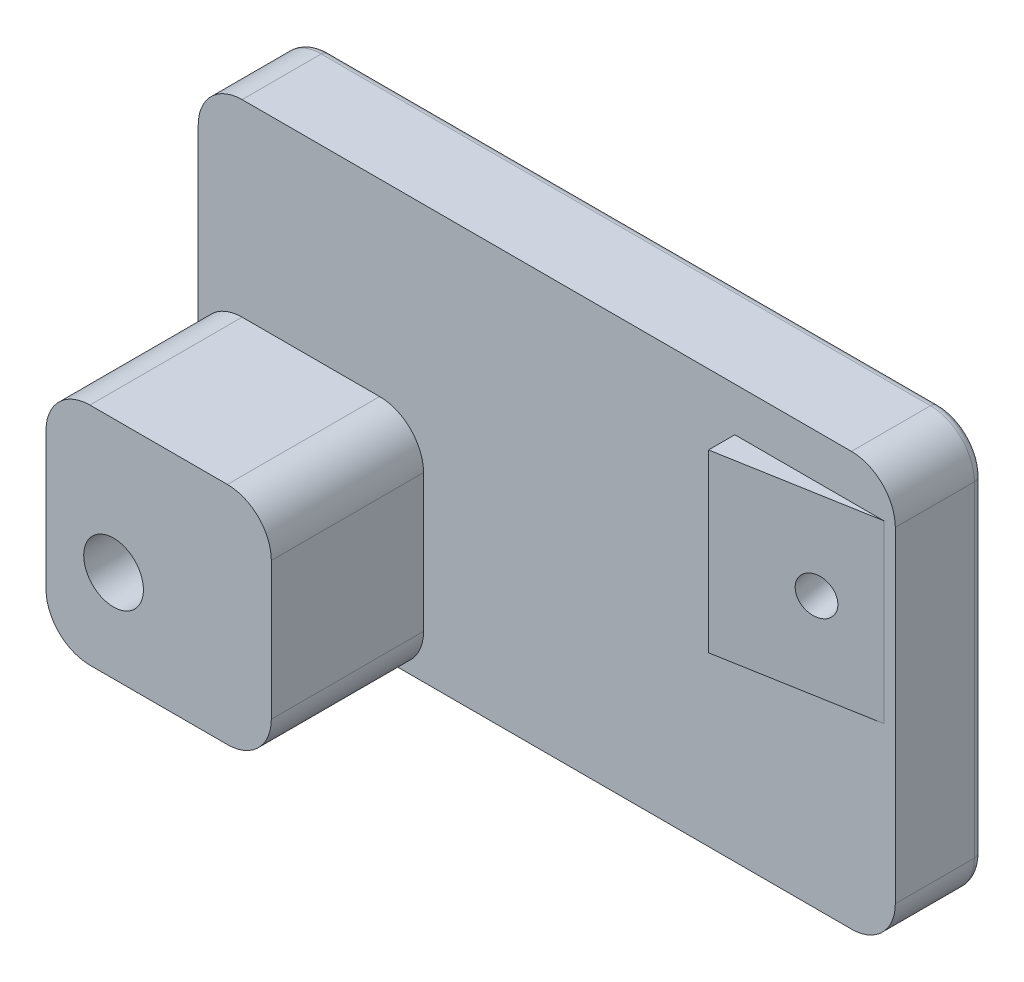
ISO-10303-21;
HEADER;
FILE_DESCRIPTION(('STEP AP214'),'2;1');
FILE_NAME('part.step','',(''),(''),'','','');
FILE_SCHEMA(('AUTOMOTIVE_DESIGN { 1 0 10303 214 1 1 1 1 }'));
ENDSEC;
DATA;
#1=APPLICATION_CONTEXT('core data for automotive mechanical design processes');
#2=APPLICATION_PROTOCOL_DEFINITION('international standard','automotive_design',2000,#1);
#3=PRODUCT_CONTEXT('',#1,'mechanical');
#4=PRODUCT('Part','Part','',(#3));
#5=PRODUCT_RELATED_PRODUCT_CATEGORY('part','',(#4));
#6=PRODUCT_DEFINITION_FORMATION('','',#4);
#7=PRODUCT_DEFINITION_CONTEXT('part definition',#1,'design');
#8=PRODUCT_DEFINITION('design','',#6,#7);
#9=PRODUCT_DEFINITION_SHAPE('','',#8);
#10=(LENGTH_UNIT() NAMED_UNIT(*) SI_UNIT(.MILLI.,.METRE.));
#11=(NAMED_UNIT(*) PLANE_ANGLE_UNIT() SI_UNIT($,.RADIAN.));
#12=(NAMED_UNIT(*) SI_UNIT($,.STERADIAN.) SOLID_ANGLE_UNIT());
#13=UNCERTAINTY_MEASURE_WITH_UNIT(LENGTH_MEASURE(1.E-05),#10,'distance_accuracy_value','');
#14=(GEOMETRIC_REPRESENTATION_CONTEXT(3) GLOBAL_UNCERTAINTY_ASSIGNED_CONTEXT((#13)) GLOBAL_UNIT_ASSIGNED_CONTEXT((#10,
#11,#12)) REPRESENTATION_CONTEXT('',''));
#15=CARTESIAN_POINT('',(0.,0.,0.));
#16=DIRECTION('',(0.,0.,1.));
#17=DIRECTION('',(1.,0.,0.));
#18=AXIS2_PLACEMENT_3D('',#15,#16,#17);
#19=CARTESIAN_POINT('',(-15.6825473539519,-7.92032989690722,10.));
#20=DIRECTION('',(-1.,0.,0.));
#21=DIRECTION('',(0.,-1.,0.));
#22=AXIS2_PLACEMENT_3D('',#19,#20,#21);
#23=PLANE('',#22);
#24=DIRECTION('',(0.,1.,0.));
#25=VECTOR('',#24,1.);
#26=CARTESIAN_POINT('',(-15.6825473539519,-7.92032989690722,10.));
#27=LINE('',#26,#25);
#28=CARTESIAN_POINT('',(-15.6825473539519,-25.0233148041237,10.));
#29=VERTEX_POINT('',#28);
#30=CARTESIAN_POINT('',(-15.6825473539519,-25.0230836681071,10.));
#31=VERTEX_POINT('',#30);
#32=EDGE_CURVE('E268',#29,#31,#27,.T.);
#33=ORIENTED_EDGE('',*,*,#32,.T.);
#34=DIRECTION('',(0.,0.,1.));
#35=VECTOR('',#34,1.);
#36=CARTESIAN_POINT('',(-15.6825473539519,-25.0230836681071,7.3288));
#37=LINE('',#36,#35);
#38=CARTESIAN_POINT('',(-15.6825473539519,-25.0230836681071,27.3288));
#39=VERTEX_POINT('',#38);
#40=EDGE_CURVE('E258',#31,#39,#37,.T.);
#41=ORIENTED_EDGE('',*,*,#40,.T.);
#42=DIRECTION('',(0.,1.,0.));
#43=VECTOR('',#42,1.);
#44=CARTESIAN_POINT('',(-15.6825473539519,-25.0233148041237,27.3288));
#45=LINE('',#44,#43);
#46=CARTESIAN_POINT('',(-15.6825473539519,-25.0233148041237,27.3288));
#47=VERTEX_POINT('',#46);
#48=EDGE_CURVE('E221',#47,#39,#45,.T.);
#49=ORIENTED_EDGE('',*,*,#48,.F.);
#50=DIRECTION('',(0.,0.,-1.));
#51=VECTOR('',#50,1.);
#52=CARTESIAN_POINT('',(-15.6825473539519,-25.0233148041237,10.));
#53=LINE('',#52,#51);
#54=EDGE_CURVE('E280',#47,#29,#53,.T.);
#55=ORIENTED_EDGE('',*,*,#54,.T.);
#56=EDGE_LOOP('',(#33,#41,#49,#55));
#57=FACE_BOUND('',#56,.T.);
#58=ADVANCED_FACE('F49',(#57),#23,.F.);
#59=CARTESIAN_POINT('',(0.,0.,10.));
#60=DIRECTION('',(0.,0.,1.));
#61=DIRECTION('',(1.,0.,0.));
#62=AXIS2_PLACEMENT_3D('',#59,#60,#61);
#63=PLANE('',#62);
#64=DIRECTION('',(0.,-1.,0.));
#65=VECTOR('',#64,1.);
#66=CARTESIAN_POINT('',(42.9798903107861,22.0796701030928,10.));
#67=LINE('',#66,#65);
#68=CARTESIAN_POINT('',(42.9798903107861,17.0796701030928,10.));
#69=VERTEX_POINT('',#68);
#70=CARTESIAN_POINT('',(42.9798903107861,-20.0233148041237,10.));
#71=VERTEX_POINT('',#70);
#72=EDGE_CURVE('E323',#69,#71,#67,.T.);
#73=ORIENTED_EDGE('',*,*,#72,.F.);
#74=CARTESIAN_POINT('',(37.9798903107861,17.0796701030928,10.));
#75=DIRECTION('',(0.,0.,1.));
#76=DIRECTION('',(1.,0.,0.));
#77=AXIS2_PLACEMENT_3D('',#74,#75,#76);
#78=CIRCLE('',#77,5.);
#79=CARTESIAN_POINT('',(37.9798903107861,22.0796701030928,10.));
#80=VERTEX_POINT('',#79);
#81=EDGE_CURVE('E374',#69,#80,#78,.T.);
#82=ORIENTED_EDGE('',*,*,#81,.T.);
#83=DIRECTION('',(1.,0.,0.));
#84=VECTOR('',#83,1.);
#85=CARTESIAN_POINT('',(-49.3824879725086,22.0796701030928,10.));
#86=LINE('',#85,#84);
#87=CARTESIAN_POINT('',(-31.3824879725086,22.0796701030928,10.));
#88=VERTEX_POINT('',#87);
#89=EDGE_CURVE('E332',#88,#80,#86,.T.);
#90=ORIENTED_EDGE('',*,*,#89,.F.);
#91=CARTESIAN_POINT('',(-31.3824879725086,17.0796701030928,10.));
#92=DIRECTION('',(0.,0.,1.));
#93=DIRECTION('',(1.,0.,0.));
#94=AXIS2_PLACEMENT_3D('',#91,#92,#93);
#95=CIRCLE('',#94,5.);
#96=CARTESIAN_POINT('',(-36.3824879725086,17.0796701030928,10.));
#97=VERTEX_POINT('',#96);
#98=EDGE_CURVE('E368',#88,#97,#95,.T.);
#99=ORIENTED_EDGE('',*,*,#98,.T.);
#100=DIRECTION('',(0.,-1.,0.));
#101=VECTOR('',#100,1.);
#102=CARTESIAN_POINT('',(-36.3824879725086,0.,10.));
#103=LINE('',#102,#101);
#104=CARTESIAN_POINT('',(-36.3824879725086,-4.37145023722082,10.));
#105=VERTEX_POINT('',#104);
#106=EDGE_CURVE('E284',#97,#105,#103,.T.);
#107=ORIENTED_EDGE('',*,*,#106,.T.);
#108=CARTESIAN_POINT('',(-31.3824879725086,-4.37145023722078,10.));
#109=DIRECTION('',(0.,0.,1.));
#110=DIRECTION('',(1.,0.,0.));
#111=AXIS2_PLACEMENT_3D('',#108,#109,#110);
#112=CIRCLE('',#111,5.);
#113=CARTESIAN_POINT('',(-31.3824879725086,0.628549762779219,10.));
#114=VERTEX_POINT('',#113);
#115=EDGE_CURVE('E261',#114,#105,#112,.T.);
#116=ORIENTED_EDGE('',*,*,#115,.F.);
#117=DIRECTION('',(-1.,0.,0.));
#118=VECTOR('',#117,1.);
#119=CARTESIAN_POINT('',(0.,0.628549762779221,10.));
#120=LINE('',#119,#118);
#121=CARTESIAN_POINT('',(-15.7306234056057,0.628549762779221,10.));
#122=VERTEX_POINT('',#121);
#123=EDGE_CURVE('E342',#122,#114,#120,.T.);
#124=ORIENTED_EDGE('',*,*,#123,.F.);
#125=CARTESIAN_POINT('',(-15.7306234056057,-4.37145023722078,10.));
#126=DIRECTION('',(0.,0.,1.));
#127=DIRECTION('',(1.,0.,0.));
#128=AXIS2_PLACEMENT_3D('',#125,#126,#127);
#129=CIRCLE('',#128,5.);
#130=CARTESIAN_POINT('',(-10.7306234056057,-4.37145023722078,10.));
#131=VERTEX_POINT('',#130);
#132=EDGE_CURVE('E339',#131,#122,#129,.T.);
#133=ORIENTED_EDGE('',*,*,#132,.F.);
#134=DIRECTION('',(0.,1.,0.));
#135=VECTOR('',#134,1.);
#136=CARTESIAN_POINT('',(-10.7306234056057,0.,10.));
#137=LINE('',#136,#135);
#138=CARTESIAN_POINT('',(-10.7306234056057,-20.0233148041237,10.));
#139=VERTEX_POINT('',#138);
#140=EDGE_CURVE('E336',#139,#131,#137,.T.);
#141=ORIENTED_EDGE('',*,*,#140,.F.);
#142=CARTESIAN_POINT('',(-15.7306234056057,-20.0233148041237,10.));
#143=DIRECTION('',(0.,0.,1.));
#144=DIRECTION('',(1.,0.,0.));
#145=AXIS2_PLACEMENT_3D('',#142,#143,#144);
#146=CIRCLE('',#145,5.);
#147=EDGE_CURVE('E205',#31,#139,#146,.T.);
#148=ORIENTED_EDGE('',*,*,#147,.F.);
#149=ORIENTED_EDGE('',*,*,#32,.F.);
#150=DIRECTION('',(-1.,0.,0.));
#151=VECTOR('',#150,1.);
#152=CARTESIAN_POINT('',(42.9798903107861,-25.0233148041237,10.));
#153=LINE('',#152,#151);
#154=CARTESIAN_POINT('',(37.9798903107861,-25.0233148041237,10.));
#155=VERTEX_POINT('',#154);
#156=EDGE_CURVE('E265',#155,#29,#153,.T.);
#157=ORIENTED_EDGE('',*,*,#156,.F.);
#158=CARTESIAN_POINT('',(37.9798903107861,-20.0233148041237,10.));
#159=DIRECTION('',(0.,0.,1.));
#160=DIRECTION('',(1.,0.,0.));
#161=AXIS2_PLACEMENT_3D('',#158,#159,#160);
#162=CIRCLE('',#161,5.);
#163=EDGE_CURVE('E371',#155,#71,#162,.T.);
#164=ORIENTED_EDGE('',*,*,#163,.T.);
#165=EDGE_LOOP('',(#73,#82,#90,#99,#107,#116,#124,#133,#141,#148,#149,#157,#164));
#166=FACE_BOUND('',#165,.T.);
#167=DIRECTION('',(0.,1.,0.));
#168=VECTOR('',#167,1.);
#169=CARTESIAN_POINT('',(41.6731279707496,-2.92032989690722,10.));
#170=LINE('',#169,#168);
#171=CARTESIAN_POINT('',(41.6731279707496,-2.92032989690722,10.));
#172=VERTEX_POINT('',#171);
#173=CARTESIAN_POINT('',(41.6731279707496,17.0796701030928,10.));
#174=VERTEX_POINT('',#173);
#175=EDGE_CURVE('E319',#172,#174,#170,.T.);
#176=ORIENTED_EDGE('',*,*,#175,.F.);
#177=DIRECTION('',(-1.,0.,0.));
#178=VECTOR('',#177,1.);
#179=CARTESIAN_POINT('',(41.6731279707496,-2.92032989690722,10.));
#180=LINE('',#179,#178);
#181=CARTESIAN_POINT('',(24.7071279707496,-2.92032989690722,10.));
#182=VERTEX_POINT('',#181);
#183=EDGE_CURVE('E296',#172,#182,#180,.T.);
#184=ORIENTED_EDGE('',*,*,#183,.T.);
#185=DIRECTION('',(0.,1.,0.));
#186=VECTOR('',#185,1.);
#187=CARTESIAN_POINT('',(24.7071279707496,-2.92032989690722,10.));
#188=LINE('',#187,#186);
#189=CARTESIAN_POINT('',(24.7071279707496,17.0796701030928,10.));
#190=VERTEX_POINT('',#189);
#191=EDGE_CURVE('E308',#182,#190,#188,.T.);
#192=ORIENTED_EDGE('',*,*,#191,.T.);
#193=DIRECTION('',(-1.,0.,0.));
#194=VECTOR('',#193,1.);
#195=CARTESIAN_POINT('',(41.6731279707496,17.0796701030928,10.));
#196=LINE('',#195,#194);
#197=EDGE_CURVE('E295',#174,#190,#196,.T.);
#198=ORIENTED_EDGE('',*,*,#197,.F.);
#199=EDGE_LOOP('',(#176,#184,#192,#198));
#200=FACE_BOUND('',#199,.T.);
#201=ADVANCED_FACE('F491',(#166,#200),#63,.T.);
#202=CARTESIAN_POINT('',(-49.3824879725086,22.0796701030928,10.));
#203=DIRECTION('',(0.,1.,0.));
#204=DIRECTION('',(0.,0.,1.));
#205=AXIS2_PLACEMENT_3D('',#202,#203,#204);
#206=PLANE('',#205);
#207=DIRECTION('',(0.,0.,-1.));
#208=VECTOR('',#207,1.);
#209=CARTESIAN_POINT('',(37.9798903107861,22.0796701030928,10.));
#210=LINE('',#209,#208);
#211=CARTESIAN_POINT('',(37.9798903107861,22.0796701030928,0.999999999999999));
#212=VERTEX_POINT('',#211);
#213=EDGE_CURVE('E357',#80,#212,#210,.T.);
#214=ORIENTED_EDGE('',*,*,#213,.T.);
#215=DIRECTION('',(1.,0.,0.));
#216=VECTOR('',#215,1.);
#217=CARTESIAN_POINT('',(-31.3824879725086,22.0796701030928,1.));
#218=LINE('',#217,#216);
#219=CARTESIAN_POINT('',(-31.3824879725086,22.0796701030928,0.999999999999999));
#220=VERTEX_POINT('',#219);
#221=EDGE_CURVE('E411',#212,#220,#218,.F.);
#222=ORIENTED_EDGE('',*,*,#221,.T.);
#223=DIRECTION('',(0.,0.,1.));
#224=VECTOR('',#223,1.);
#225=CARTESIAN_POINT('',(-31.3824879725086,22.0796701030928,10.));
#226=LINE('',#225,#224);
#227=EDGE_CURVE('E354',#220,#88,#226,.T.);
#228=ORIENTED_EDGE('',*,*,#227,.T.);
#229=ORIENTED_EDGE('',*,*,#89,.T.);
#230=EDGE_LOOP('',(#214,#222,#228,#229));
#231=FACE_BOUND('',#230,.T.);
#232=ADVANCED_FACE('F497',(#231),#206,.T.);
#233=CARTESIAN_POINT('',(0.,0.,0.));
#234=DIRECTION('',(0.,0.,1.));
#235=DIRECTION('',(1.,0.,0.));
#236=AXIS2_PLACEMENT_3D('',#233,#234,#235);
#237=PLANE('',#236);
#238=DIRECTION('',(0.,-1.,0.));
#239=VECTOR('',#238,1.);
#240=CARTESIAN_POINT('',(-35.3824879725086,17.0796701030928,0.));
#241=LINE('',#240,#239);
#242=CARTESIAN_POINT('',(-35.3824879725086,-20.0233148041237,0.));
#243=VERTEX_POINT('',#242);
#244=CARTESIAN_POINT('',(-35.3824879725086,17.0796701030928,0.));
#245=VERTEX_POINT('',#244);
#246=EDGE_CURVE('E382',#243,#245,#241,.F.);
#247=ORIENTED_EDGE('',*,*,#246,.T.);
#248=CARTESIAN_POINT('',(-31.3824879725086,17.0796701030928,0.));
#249=DIRECTION('',(0.,0.,1.));
#250=DIRECTION('',(1.,0.,0.));
#251=AXIS2_PLACEMENT_3D('',#248,#249,#250);
#252=CIRCLE('',#251,4.);
#253=CARTESIAN_POINT('',(-31.3824879725086,21.0796701030928,0.));
#254=VERTEX_POINT('',#253);
#255=EDGE_CURVE('E403',#245,#254,#252,.F.);
#256=ORIENTED_EDGE('',*,*,#255,.T.);
#257=DIRECTION('',(1.,0.,0.));
#258=VECTOR('',#257,1.);
#259=CARTESIAN_POINT('',(37.9798903107861,21.0796701030928,0.));
#260=LINE('',#259,#258);
#261=CARTESIAN_POINT('',(37.9798903107861,21.0796701030928,0.));
#262=VERTEX_POINT('',#261);
#263=EDGE_CURVE('E400',#254,#262,#260,.T.);
#264=ORIENTED_EDGE('',*,*,#263,.T.);
#265=CARTESIAN_POINT('',(37.9798903107861,17.0796701030928,0.));
#266=DIRECTION('',(0.,0.,1.));
#267=DIRECTION('',(1.,0.,0.));
#268=AXIS2_PLACEMENT_3D('',#265,#266,#267);
#269=CIRCLE('',#268,4.);
#270=CARTESIAN_POINT('',(41.9798903107861,17.0796701030928,0.));
#271=VERTEX_POINT('',#270);
#272=EDGE_CURVE('E397',#262,#271,#269,.F.);
#273=ORIENTED_EDGE('',*,*,#272,.T.);
#274=DIRECTION('',(0.,-1.,0.));
#275=VECTOR('',#274,1.);
#276=CARTESIAN_POINT('',(41.9798903107861,-20.0233148041237,0.));
#277=LINE('',#276,#275);
#278=CARTESIAN_POINT('',(41.9798903107861,-20.0233148041237,0.));
#279=VERTEX_POINT('',#278);
#280=EDGE_CURVE('E394',#271,#279,#277,.T.);
#281=ORIENTED_EDGE('',*,*,#280,.T.);
#282=CARTESIAN_POINT('',(37.9798903107861,-20.0233148041237,0.));
#283=DIRECTION('',(0.,0.,1.));
#284=DIRECTION('',(1.,0.,0.));
#285=AXIS2_PLACEMENT_3D('',#282,#283,#284);
#286=CIRCLE('',#285,4.);
#287=CARTESIAN_POINT('',(37.9798903107861,-24.0233148041237,0.));
#288=VERTEX_POINT('',#287);
#289=EDGE_CURVE('E391',#279,#288,#286,.F.);
#290=ORIENTED_EDGE('',*,*,#289,.T.);
#291=DIRECTION('',(1.,0.,0.));
#292=VECTOR('',#291,1.);
#293=CARTESIAN_POINT('',(-31.3824879725086,-24.0233148041237,0.));
#294=LINE('',#293,#292);
#295=CARTESIAN_POINT('',(-31.3824879725086,-24.0233148041237,0.));
#296=VERTEX_POINT('',#295);
#297=EDGE_CURVE('E388',#288,#296,#294,.F.);
#298=ORIENTED_EDGE('',*,*,#297,.T.);
#299=CARTESIAN_POINT('',(-31.3824879725086,-20.0233148041237,0.));
#300=DIRECTION('',(0.,0.,1.));
#301=DIRECTION('',(1.,0.,0.));
#302=AXIS2_PLACEMENT_3D('',#299,#300,#301);
#303=CIRCLE('',#302,4.);
#304=EDGE_CURVE('E385',#296,#243,#303,.F.);
#305=ORIENTED_EDGE('',*,*,#304,.T.);
#306=EDGE_LOOP('',(#247,#256,#264,#273,#281,#290,#298,#305));
#307=FACE_BOUND('',#306,.T.);
#308=CARTESIAN_POINT('',(-28.6924879725086,-14.5403298969072,0.));
#309=DIRECTION('',(0.,0.,-1.));
#310=DIRECTION('',(-1.,0.,0.));
#311=AXIS2_PLACEMENT_3D('',#308,#309,#310);
#312=CIRCLE('',#311,3.39999999999999);
#313=CARTESIAN_POINT('',(-32.0924879725086,-14.5403298969072,0.));
#314=VERTEX_POINT('',#313);
#315=EDGE_CURVE('E459',#314,#314,#312,.T.);
#316=ORIENTED_EDGE('',*,*,#315,.F.);
#317=EDGE_LOOP('',(#316));
#318=FACE_BOUND('',#317,.T.);
#319=CARTESIAN_POINT('',(33.1901279707496,6.9926873857404,0.));
#320=DIRECTION('',(0.,0.,1.));
#321=DIRECTION('',(1.,0.,0.));
#322=AXIS2_PLACEMENT_3D('',#319,#320,#321);
#323=ELLIPSE('',#322,2.13239588496006,2.1);
#324=CARTESIAN_POINT('',(35.3225238557096,6.9926873857404,0.));
#325=VERTEX_POINT('',#324);
#326=EDGE_CURVE('E291',#325,#325,#323,.T.);
#327=ORIENTED_EDGE('',*,*,#326,.T.);
#328=EDGE_LOOP('',(#327));
#329=FACE_BOUND('',#328,.T.);
#330=ADVANCED_FACE('F531',(#307,#318,#329),#237,.F.);
#331=CARTESIAN_POINT('',(42.9798903107861,22.0796701030928,10.));
#332=DIRECTION('',(1.,0.,0.));
#333=DIRECTION('',(0.,1.,0.));
#334=AXIS2_PLACEMENT_3D('',#331,#332,#333);
#335=PLANE('',#334);
#336=DIRECTION('',(0.,0.,-1.));
#337=VECTOR('',#336,1.);
#338=CARTESIAN_POINT('',(42.9798903107861,-20.0233148041237,10.));
#339=LINE('',#338,#337);
#340=CARTESIAN_POINT('',(42.9798903107861,-20.0233148041237,0.999999999999999));
#341=VERTEX_POINT('',#340);
#342=EDGE_CURVE('E361',#71,#341,#339,.T.);
#343=ORIENTED_EDGE('',*,*,#342,.T.);
#344=DIRECTION('',(0.,-1.,0.));
#345=VECTOR('',#344,1.);
#346=CARTESIAN_POINT('',(42.9798903107861,17.0796701030928,1.));
#347=LINE('',#346,#345);
#348=CARTESIAN_POINT('',(42.9798903107861,17.0796701030928,0.999999999999999));
#349=VERTEX_POINT('',#348);
#350=EDGE_CURVE('E417',#341,#349,#347,.F.);
#351=ORIENTED_EDGE('',*,*,#350,.T.);
#352=DIRECTION('',(0.,0.,-1.));
#353=VECTOR('',#352,1.);
#354=CARTESIAN_POINT('',(42.9798903107861,17.0796701030928,10.));
#355=LINE('',#354,#353);
#356=EDGE_CURVE('E365',#349,#69,#355,.F.);
#357=ORIENTED_EDGE('',*,*,#356,.T.);
#358=ORIENTED_EDGE('',*,*,#72,.T.);
#359=EDGE_LOOP('',(#343,#351,#357,#358));
#360=FACE_BOUND('',#359,.T.);
#361=ADVANCED_FACE('F526',(#360),#335,.T.);
#362=CARTESIAN_POINT('',(24.7071279707496,-2.92032989690722,12.9915635546997));
#363=DIRECTION('',(0.173648177666924,0.,0.984807753012209));
#364=DIRECTION('',(0.984807753012209,0.,-0.173648177666924));
#365=AXIS2_PLACEMENT_3D('',#362,#363,#364);
#366=PLANE('',#365);
#367=CARTESIAN_POINT('',(35.1560224363144,6.9926873857404,11.1491415418453));
#368=DIRECTION('',(0.173648177666924,0.,0.984807753012209));
#369=DIRECTION('',(0.984807753012209,0.,-0.173648177666924));
#370=AXIS2_PLACEMENT_3D('',#367,#368,#369);
#371=CIRCLE('',#370,2.1);
#372=CARTESIAN_POINT('',(37.22411871764,6.9926873857404,10.7844803687448));
#373=VERTEX_POINT('',#372);
#374=EDGE_CURVE('E287',#373,#373,#371,.T.);
#375=ORIENTED_EDGE('',*,*,#374,.F.);
#376=EDGE_LOOP('',(#375));
#377=FACE_BOUND('',#376,.T.);
#378=DIRECTION('',(0.984807753012209,0.,-0.173648177666924));
#379=VECTOR('',#378,1.);
#380=CARTESIAN_POINT('',(24.7071279707496,17.0796701030928,12.9915635546997));
#381=LINE('',#380,#379);
#382=CARTESIAN_POINT('',(24.7071279707496,17.0796701030928,12.9915635546997));
#383=VERTEX_POINT('',#382);
#384=EDGE_CURVE('E300',#383,#174,#381,.T.);
#385=ORIENTED_EDGE('',*,*,#384,.F.);
#386=DIRECTION('',(0.,1.,0.));
#387=VECTOR('',#386,1.);
#388=CARTESIAN_POINT('',(24.7071279707496,-2.92032989690722,12.9915635546997));
#389=LINE('',#388,#387);
#390=CARTESIAN_POINT('',(24.7071279707496,-2.92032989690722,12.9915635546997));
#391=VERTEX_POINT('',#390);
#392=EDGE_CURVE('E324',#391,#383,#389,.T.);
#393=ORIENTED_EDGE('',*,*,#392,.F.);
#394=DIRECTION('',(0.984807753012209,0.,-0.173648177666924));
#395=VECTOR('',#394,1.);
#396=CARTESIAN_POINT('',(24.7071279707496,-2.92032989690722,12.9915635546997));
#397=LINE('',#396,#395);
#398=EDGE_CURVE('E304',#391,#172,#397,.T.);
#399=ORIENTED_EDGE('',*,*,#398,.T.);
#400=ORIENTED_EDGE('',*,*,#175,.T.);
#401=EDGE_LOOP('',(#385,#393,#399,#400));
#402=FACE_BOUND('',#401,.T.);
#403=ADVANCED_FACE('F523',(#377,#402),#366,.T.);
#404=CARTESIAN_POINT('',(24.7071279707496,-2.92032989690722,10.));
#405=DIRECTION('',(-1.,0.,0.));
#406=DIRECTION('',(0.,0.,1.));
#407=AXIS2_PLACEMENT_3D('',#404,#405,#406);
#408=PLANE('',#407);
#409=DIRECTION('',(0.,0.,1.));
#410=VECTOR('',#409,1.);
#411=CARTESIAN_POINT('',(24.7071279707496,17.0796701030928,10.));
#412=LINE('',#411,#410);
#413=EDGE_CURVE('E312',#190,#383,#412,.T.);
#414=ORIENTED_EDGE('',*,*,#413,.F.);
#415=ORIENTED_EDGE('',*,*,#191,.F.);
#416=DIRECTION('',(0.,0.,1.));
#417=VECTOR('',#416,1.);
#418=CARTESIAN_POINT('',(24.7071279707496,-2.92032989690722,10.));
#419=LINE('',#418,#417);
#420=EDGE_CURVE('E299',#182,#391,#419,.T.);
#421=ORIENTED_EDGE('',*,*,#420,.T.);
#422=ORIENTED_EDGE('',*,*,#392,.T.);
#423=EDGE_LOOP('',(#414,#415,#421,#422));
#424=FACE_BOUND('',#423,.T.);
#425=ADVANCED_FACE('F518',(#424),#408,.T.);
#426=CARTESIAN_POINT('',(0.,-2.92032989690722,0.));
#427=DIRECTION('',(0.,1.,0.));
#428=DIRECTION('',(0.,0.,1.));
#429=AXIS2_PLACEMENT_3D('',#426,#427,#428);
#430=PLANE('',#429);
#431=ORIENTED_EDGE('',*,*,#183,.F.);
#432=ORIENTED_EDGE('',*,*,#398,.F.);
#433=ORIENTED_EDGE('',*,*,#420,.F.);
#434=EDGE_LOOP('',(#431,#432,#433));
#435=FACE_BOUND('',#434,.T.);
#436=ADVANCED_FACE('F515',(#435),#430,.F.);
#437=CARTESIAN_POINT('',(0.,17.0796701030928,0.));
#438=DIRECTION('',(0.,1.,0.));
#439=DIRECTION('',(0.,0.,1.));
#440=AXIS2_PLACEMENT_3D('',#437,#438,#439);
#441=PLANE('',#440);
#442=ORIENTED_EDGE('',*,*,#197,.T.);
#443=ORIENTED_EDGE('',*,*,#413,.T.);
#444=ORIENTED_EDGE('',*,*,#384,.T.);
#445=EDGE_LOOP('',(#442,#443,#444));
#446=FACE_BOUND('',#445,.T.);
#447=ADVANCED_FACE('F513',(#446),#441,.T.);
#448=CARTESIAN_POINT('',(35.1560224363144,6.9926873857404,11.1491415418453));
#449=DIRECTION('',(0.173648177666924,0.,0.984807753012209));
#450=DIRECTION('',(0.984807753012209,0.,-0.173648177666924));
#451=AXIS2_PLACEMENT_3D('',#448,#449,#450);
#452=CYLINDRICAL_SURFACE('',#451,2.1);
#453=ORIENTED_EDGE('',*,*,#374,.T.);
#454=EDGE_LOOP('',(#453));
#455=FACE_BOUND('',#454,.T.);
#456=ORIENTED_EDGE('',*,*,#326,.F.);
#457=EDGE_LOOP('',(#456));
#458=FACE_BOUND('',#457,.T.);
#459=ADVANCED_FACE('F509',(#455,#458),#452,.F.);
#460=CARTESIAN_POINT('',(0.,-25.0233148041237,0.));
#461=DIRECTION('',(0.,-1.,0.));
#462=DIRECTION('',(0.,0.,-1.));
#463=AXIS2_PLACEMENT_3D('',#460,#461,#462);
#464=PLANE('',#463);
#465=DIRECTION('',(0.,0.,1.));
#466=VECTOR('',#465,1.);
#467=CARTESIAN_POINT('',(-31.3824879725086,-25.0233148041237,0.));
#468=LINE('',#467,#466);
#469=CARTESIAN_POINT('',(-31.3824879725086,-25.0233148041237,27.3288));
#470=VERTEX_POINT('',#469);
#471=CARTESIAN_POINT('',(-31.3824879725086,-25.0233148041237,1.));
#472=VERTEX_POINT('',#471);
#473=EDGE_CURVE('E351',#470,#472,#468,.F.);
#474=ORIENTED_EDGE('',*,*,#473,.T.);
#475=DIRECTION('',(1.,0.,0.));
#476=VECTOR('',#475,1.);
#477=CARTESIAN_POINT('',(37.9798903107861,-25.0233148041237,1.));
#478=LINE('',#477,#476);
#479=CARTESIAN_POINT('',(37.9798903107861,-25.0233148041237,1.));
#480=VERTEX_POINT('',#479);
#481=EDGE_CURVE('E423',#472,#480,#478,.T.);
#482=ORIENTED_EDGE('',*,*,#481,.T.);
#483=DIRECTION('',(0.,0.,-1.));
#484=VECTOR('',#483,1.);
#485=CARTESIAN_POINT('',(37.9798903107861,-25.0233148041237,0.));
#486=LINE('',#485,#484);
#487=EDGE_CURVE('E377',#480,#155,#486,.F.);
#488=ORIENTED_EDGE('',*,*,#487,.T.);
#489=ORIENTED_EDGE('',*,*,#156,.T.);
#490=ORIENTED_EDGE('',*,*,#54,.F.);
#491=DIRECTION('',(1.,0.,0.));
#492=VECTOR('',#491,1.);
#493=CARTESIAN_POINT('',(-15.6825473539519,-25.0233148041237,27.3288));
#494=LINE('',#493,#492);
#495=EDGE_CURVE('E277',#470,#47,#494,.T.);
#496=ORIENTED_EDGE('',*,*,#495,.F.);
#497=EDGE_LOOP('',(#474,#482,#488,#489,#490,#496));
#498=FACE_BOUND('',#497,.T.);
#499=ADVANCED_FACE('F506',(#498),#464,.T.);
#500=CARTESIAN_POINT('',(-36.3824879725086,0.,0.));
#501=DIRECTION('',(-1.,0.,0.));
#502=DIRECTION('',(0.,-1.,0.));
#503=AXIS2_PLACEMENT_3D('',#500,#501,#502);
#504=PLANE('',#503);
#505=DIRECTION('',(0.,0.,1.));
#506=VECTOR('',#505,1.);
#507=CARTESIAN_POINT('',(-36.3824879725086,17.0796701030928,0.));
#508=LINE('',#507,#506);
#509=CARTESIAN_POINT('',(-36.3824879725086,17.0796701030928,1.));
#510=VERTEX_POINT('',#509);
#511=EDGE_CURVE('E380',#97,#510,#508,.F.);
#512=ORIENTED_EDGE('',*,*,#511,.T.);
#513=DIRECTION('',(0.,-1.,0.));
#514=VECTOR('',#513,1.);
#515=CARTESIAN_POINT('',(-36.3824879725086,-20.0233148041237,1.));
#516=LINE('',#515,#514);
#517=CARTESIAN_POINT('',(-36.3824879725086,-20.0233148041237,1.));
#518=VERTEX_POINT('',#517);
#519=EDGE_CURVE('E11',#510,#518,#516,.T.);
#520=ORIENTED_EDGE('',*,*,#519,.T.);
#521=DIRECTION('',(0.,0.,1.));
#522=VECTOR('',#521,1.);
#523=CARTESIAN_POINT('',(-36.3824879725086,-20.0233148041237,0.));
#524=LINE('',#523,#522);
#525=CARTESIAN_POINT('',(-36.3824879725086,-20.0233148041237,27.3288));
#526=VERTEX_POINT('',#525);
#527=EDGE_CURVE('E345',#518,#526,#524,.T.);
#528=ORIENTED_EDGE('',*,*,#527,.T.);
#529=DIRECTION('',(0.,-1.,0.));
#530=VECTOR('',#529,1.);
#531=CARTESIAN_POINT('',(-36.3824879725086,-25.0233148041237,27.3288));
#532=LINE('',#531,#530);
#533=CARTESIAN_POINT('',(-36.3824879725086,-4.37145023722082,27.3288));
#534=VERTEX_POINT('',#533);
#535=EDGE_CURVE('E274',#534,#526,#532,.T.);
#536=ORIENTED_EDGE('',*,*,#535,.F.);
#537=DIRECTION('',(0.,0.,1.));
#538=VECTOR('',#537,1.);
#539=CARTESIAN_POINT('',(-36.3824879725086,-4.37145023722082,7.3288));
#540=LINE('',#539,#538);
#541=EDGE_CURVE('E244',#105,#534,#540,.T.);
#542=ORIENTED_EDGE('',*,*,#541,.F.);
#543=ORIENTED_EDGE('',*,*,#106,.F.);
#544=EDGE_LOOP('',(#512,#520,#528,#536,#542,#543));
#545=FACE_BOUND('',#544,.T.);
#546=ADVANCED_FACE('F503',(#545),#504,.T.);
#547=CARTESIAN_POINT('',(0.,0.,27.3288));
#548=DIRECTION('',(0.,0.,1.));
#549=DIRECTION('',(1.,0.,0.));
#550=AXIS2_PLACEMENT_3D('',#547,#548,#549);
#551=PLANE('',#550);
#552=CARTESIAN_POINT('',(-28.6924879725086,-14.5403298969072,27.3288));
#553=DIRECTION('',(0.,0.,-1.));
#554=DIRECTION('',(-1.,0.,0.));
#555=AXIS2_PLACEMENT_3D('',#552,#553,#554);
#556=CIRCLE('',#555,3.39999999999999);
#557=CARTESIAN_POINT('',(-32.0924879725086,-14.5403298969072,27.3288));
#558=VERTEX_POINT('',#557);
#559=EDGE_CURVE('E223',#558,#558,#556,.T.);
#560=ORIENTED_EDGE('',*,*,#559,.T.);
#561=EDGE_LOOP('',(#560));
#562=FACE_BOUND('',#561,.T.);
#563=ORIENTED_EDGE('',*,*,#535,.T.);
#564=CARTESIAN_POINT('',(-31.3824879725086,-20.0233148041237,27.3288));
#565=DIRECTION('',(0.,0.,1.));
#566=DIRECTION('',(1.,0.,0.));
#567=AXIS2_PLACEMENT_3D('',#564,#565,#566);
#568=CIRCLE('',#567,5.);
#569=EDGE_CURVE('E348',#526,#470,#568,.T.);
#570=ORIENTED_EDGE('',*,*,#569,.T.);
#571=ORIENTED_EDGE('',*,*,#495,.T.);
#572=ORIENTED_EDGE('',*,*,#48,.T.);
#573=CARTESIAN_POINT('',(-15.7306234056057,-20.0233148041237,27.3288));
#574=DIRECTION('',(0.,0.,1.));
#575=DIRECTION('',(1.,0.,0.));
#576=AXIS2_PLACEMENT_3D('',#573,#574,#575);
#577=CIRCLE('',#576,5.);
#578=CARTESIAN_POINT('',(-10.7306234056057,-20.0233148041237,27.3288));
#579=VERTEX_POINT('',#578);
#580=EDGE_CURVE('E202',#39,#579,#577,.T.);
#581=ORIENTED_EDGE('',*,*,#580,.T.);
#582=DIRECTION('',(0.,1.,0.));
#583=VECTOR('',#582,1.);
#584=CARTESIAN_POINT('',(-10.7306234056057,-20.0233148041237,27.3288));
#585=LINE('',#584,#583);
#586=CARTESIAN_POINT('',(-10.7306234056057,-4.37145023722078,27.3288));
#587=VERTEX_POINT('',#586);
#588=EDGE_CURVE('E219',#579,#587,#585,.T.);
#589=ORIENTED_EDGE('',*,*,#588,.T.);
#590=CARTESIAN_POINT('',(-15.7306234056057,-4.37145023722078,27.3288));
#591=DIRECTION('',(0.,0.,1.));
#592=DIRECTION('',(-1.,0.,0.));
#593=AXIS2_PLACEMENT_3D('',#590,#591,#592);
#594=CIRCLE('',#593,5.);
#595=CARTESIAN_POINT('',(-15.7306234056057,0.628549762779221,27.3288));
#596=VERTEX_POINT('',#595);
#597=EDGE_CURVE('E229',#587,#596,#594,.T.);
#598=ORIENTED_EDGE('',*,*,#597,.T.);
#599=DIRECTION('',(-1.,0.,0.));
#600=VECTOR('',#599,1.);
#601=CARTESIAN_POINT('',(-31.3824879725086,0.628549762779219,27.3288));
#602=LINE('',#601,#600);
#603=CARTESIAN_POINT('',(-31.3824879725086,0.628549762779219,27.3288));
#604=VERTEX_POINT('',#603);
#605=EDGE_CURVE('E235',#596,#604,#602,.T.);
#606=ORIENTED_EDGE('',*,*,#605,.T.);
#607=CARTESIAN_POINT('',(-31.3824879725086,-4.37145023722078,27.3288));
#608=DIRECTION('',(0.,0.,1.));
#609=DIRECTION('',(-1.,0.,0.));
#610=AXIS2_PLACEMENT_3D('',#607,#608,#609);
#611=CIRCLE('',#610,5.);
#612=EDGE_CURVE('E211',#604,#534,#611,.T.);
#613=ORIENTED_EDGE('',*,*,#612,.T.);
#614=EDGE_LOOP('',(#563,#570,#571,#572,#581,#589,#598,#606,#613));
#615=FACE_BOUND('',#614,.T.);
#616=ADVANCED_FACE('F217',(#562,#615),#551,.T.);
#617=CARTESIAN_POINT('',(-15.7306234056057,-20.0233148041237,7.3288));
#618=DIRECTION('',(0.,0.,1.));
#619=DIRECTION('',(1.,0.,0.));
#620=AXIS2_PLACEMENT_3D('',#617,#618,#619);
#621=CYLINDRICAL_SURFACE('',#620,5.);
#622=ORIENTED_EDGE('',*,*,#40,.F.);
#623=ORIENTED_EDGE('',*,*,#147,.T.);
#624=DIRECTION('',(0.,0.,1.));
#625=VECTOR('',#624,1.);
#626=CARTESIAN_POINT('',(-10.7306234056057,-20.0233148041237,7.3288));
#627=LINE('',#626,#625);
#628=EDGE_CURVE('E199',#139,#579,#627,.T.);
#629=ORIENTED_EDGE('',*,*,#628,.T.);
#630=ORIENTED_EDGE('',*,*,#580,.F.);
#631=EDGE_LOOP('',(#622,#623,#629,#630));
#632=FACE_BOUND('',#631,.T.);
#633=ADVANCED_FACE('F201',(#632),#621,.T.);
#634=CARTESIAN_POINT('',(-31.3824879725086,-4.37145023722078,7.3288));
#635=DIRECTION('',(0.,0.,1.));
#636=DIRECTION('',(1.,0.,0.));
#637=AXIS2_PLACEMENT_3D('',#634,#635,#636);
#638=CYLINDRICAL_SURFACE('',#637,5.);
#639=DIRECTION('',(0.,0.,1.));
#640=VECTOR('',#639,1.);
#641=CARTESIAN_POINT('',(-31.3824879725086,0.628549762779219,7.3288));
#642=LINE('',#641,#640);
#643=EDGE_CURVE('E248',#114,#604,#642,.T.);
#644=ORIENTED_EDGE('',*,*,#643,.F.);
#645=ORIENTED_EDGE('',*,*,#115,.T.);
#646=ORIENTED_EDGE('',*,*,#541,.T.);
#647=ORIENTED_EDGE('',*,*,#612,.F.);
#648=EDGE_LOOP('',(#644,#645,#646,#647));
#649=FACE_BOUND('',#648,.T.);
#650=ADVANCED_FACE('F605',(#649),#638,.T.);
#651=CARTESIAN_POINT('',(-31.3824879725086,0.628549762779219,7.3288));
#652=DIRECTION('',(0.,1.,0.));
#653=DIRECTION('',(-1.,0.,0.));
#654=AXIS2_PLACEMENT_3D('',#651,#652,#653);
#655=PLANE('',#654);
#656=DIRECTION('',(0.,0.,1.));
#657=VECTOR('',#656,1.);
#658=CARTESIAN_POINT('',(-15.7306234056057,0.628549762779221,7.3288));
#659=LINE('',#658,#657);
#660=EDGE_CURVE('E251',#122,#596,#659,.T.);
#661=ORIENTED_EDGE('',*,*,#660,.F.);
#662=ORIENTED_EDGE('',*,*,#123,.T.);
#663=ORIENTED_EDGE('',*,*,#643,.T.);
#664=ORIENTED_EDGE('',*,*,#605,.F.);
#665=EDGE_LOOP('',(#661,#662,#663,#664));
#666=FACE_BOUND('',#665,.T.);
#667=ADVANCED_FACE('F609',(#666),#655,.T.);
#668=CARTESIAN_POINT('',(-15.7306234056057,-4.37145023722078,7.3288));
#669=DIRECTION('',(0.,0.,1.));
#670=DIRECTION('',(1.,0.,0.));
#671=AXIS2_PLACEMENT_3D('',#668,#669,#670);
#672=CYLINDRICAL_SURFACE('',#671,5.);
#673=DIRECTION('',(0.,0.,1.));
#674=VECTOR('',#673,1.);
#675=CARTESIAN_POINT('',(-10.7306234056057,-4.37145023722078,7.3288));
#676=LINE('',#675,#674);
#677=EDGE_CURVE('E210',#131,#587,#676,.T.);
#678=ORIENTED_EDGE('',*,*,#677,.F.);
#679=ORIENTED_EDGE('',*,*,#132,.T.);
#680=ORIENTED_EDGE('',*,*,#660,.T.);
#681=ORIENTED_EDGE('',*,*,#597,.F.);
#682=EDGE_LOOP('',(#678,#679,#680,#681));
#683=FACE_BOUND('',#682,.T.);
#684=ADVANCED_FACE('F487',(#683),#672,.T.);
#685=CARTESIAN_POINT('',(-10.7306234056057,-20.0233148041237,7.3288));
#686=DIRECTION('',(1.,0.,0.));
#687=DIRECTION('',(0.,0.,-1.));
#688=AXIS2_PLACEMENT_3D('',#685,#686,#687);
#689=PLANE('',#688);
#690=ORIENTED_EDGE('',*,*,#628,.F.);
#691=ORIENTED_EDGE('',*,*,#140,.T.);
#692=ORIENTED_EDGE('',*,*,#677,.T.);
#693=ORIENTED_EDGE('',*,*,#588,.F.);
#694=EDGE_LOOP('',(#690,#691,#692,#693));
#695=FACE_BOUND('',#694,.T.);
#696=ADVANCED_FACE('F225',(#695),#689,.T.);
#697=CARTESIAN_POINT('',(-28.6924879725086,-14.5403298969072,0.));
#698=DIRECTION('',(0.,0.,-1.));
#699=DIRECTION('',(-1.,0.,0.));
#700=AXIS2_PLACEMENT_3D('',#697,#698,#699);
#701=CYLINDRICAL_SURFACE('',#700,3.39999999999999);
#702=ORIENTED_EDGE('',*,*,#559,.F.);
#703=EDGE_LOOP('',(#702));
#704=FACE_BOUND('',#703,.T.);
#705=ORIENTED_EDGE('',*,*,#315,.T.);
#706=EDGE_LOOP('',(#705));
#707=FACE_BOUND('',#706,.T.);
#708=ADVANCED_FACE('F477',(#704,#707),#701,.F.);
#709=CARTESIAN_POINT('',(-31.3824879725086,-20.0233148041237,0.));
#710=DIRECTION('',(0.,0.,1.));
#711=DIRECTION('',(1.,0.,0.));
#712=AXIS2_PLACEMENT_3D('',#709,#710,#711);
#713=CYLINDRICAL_SURFACE('',#712,5.);
#714=ORIENTED_EDGE('',*,*,#527,.F.);
#715=CARTESIAN_POINT('',(-31.3824879725086,-20.0233148041237,1.));
#716=DIRECTION('',(0.,0.,1.));
#717=DIRECTION('',(1.,0.,0.));
#718=AXIS2_PLACEMENT_3D('',#715,#716,#717);
#719=CIRCLE('',#718,5.);
#720=EDGE_CURVE('E59',#518,#472,#719,.T.);
#721=ORIENTED_EDGE('',*,*,#720,.T.);
#722=ORIENTED_EDGE('',*,*,#473,.F.);
#723=ORIENTED_EDGE('',*,*,#569,.F.);
#724=EDGE_LOOP('',(#714,#721,#722,#723));
#725=FACE_BOUND('',#724,.T.);
#726=ADVANCED_FACE('F479',(#725),#713,.T.);
#727=CARTESIAN_POINT('',(37.9798903107861,17.0796701030928,10.));
#728=DIRECTION('',(0.,0.,-1.));
#729=DIRECTION('',(-1.,0.,0.));
#730=AXIS2_PLACEMENT_3D('',#727,#728,#729);
#731=CYLINDRICAL_SURFACE('',#730,5.);
#732=ORIENTED_EDGE('',*,*,#356,.F.);
#733=CARTESIAN_POINT('',(37.9798903107861,17.0796701030928,0.999999999999999));
#734=DIRECTION('',(0.,0.,1.));
#735=DIRECTION('',(1.,0.,0.));
#736=AXIS2_PLACEMENT_3D('',#733,#734,#735);
#737=CIRCLE('',#736,5.);
#738=EDGE_CURVE('E414',#349,#212,#737,.T.);
#739=ORIENTED_EDGE('',*,*,#738,.T.);
#740=ORIENTED_EDGE('',*,*,#213,.F.);
#741=ORIENTED_EDGE('',*,*,#81,.F.);
#742=EDGE_LOOP('',(#732,#739,#740,#741));
#743=FACE_BOUND('',#742,.T.);
#744=ADVANCED_FACE('F485',(#743),#731,.T.);
#745=CARTESIAN_POINT('',(37.9798903107861,-20.0233148041237,10.));
#746=DIRECTION('',(0.,0.,-1.));
#747=DIRECTION('',(-1.,0.,0.));
#748=AXIS2_PLACEMENT_3D('',#745,#746,#747);
#749=CYLINDRICAL_SURFACE('',#748,5.);
#750=ORIENTED_EDGE('',*,*,#487,.F.);
#751=CARTESIAN_POINT('',(37.9798903107861,-20.0233148041237,0.999999999999999));
#752=DIRECTION('',(0.,0.,1.));
#753=DIRECTION('',(1.,0.,0.));
#754=AXIS2_PLACEMENT_3D('',#751,#752,#753);
#755=CIRCLE('',#754,5.);
#756=EDGE_CURVE('E420',#480,#341,#755,.T.);
#757=ORIENTED_EDGE('',*,*,#756,.T.);
#758=ORIENTED_EDGE('',*,*,#342,.F.);
#759=ORIENTED_EDGE('',*,*,#163,.F.);
#760=EDGE_LOOP('',(#750,#757,#758,#759));
#761=FACE_BOUND('',#760,.T.);
#762=ADVANCED_FACE('F543',(#761),#749,.T.);
#763=CARTESIAN_POINT('',(-31.3824879725086,17.0796701030928,10.));
#764=DIRECTION('',(0.,0.,1.));
#765=DIRECTION('',(1.,0.,0.));
#766=AXIS2_PLACEMENT_3D('',#763,#764,#765);
#767=CYLINDRICAL_SURFACE('',#766,5.);
#768=ORIENTED_EDGE('',*,*,#227,.F.);
#769=CARTESIAN_POINT('',(-31.3824879725086,17.0796701030928,0.999999999999999));
#770=DIRECTION('',(0.,0.,1.));
#771=DIRECTION('',(1.,0.,0.));
#772=AXIS2_PLACEMENT_3D('',#769,#770,#771);
#773=CIRCLE('',#772,5.);
#774=EDGE_CURVE('E407',#220,#510,#773,.T.);
#775=ORIENTED_EDGE('',*,*,#774,.T.);
#776=ORIENTED_EDGE('',*,*,#511,.F.);
#777=ORIENTED_EDGE('',*,*,#98,.F.);
#778=EDGE_LOOP('',(#768,#775,#776,#777));
#779=FACE_BOUND('',#778,.T.);
#780=ADVANCED_FACE('F547',(#779),#767,.T.);
#781=CARTESIAN_POINT('',(37.9798903107861,-20.0233148041237,0.999999999999999));
#782=DIRECTION('',(0.,0.,1.));
#783=DIRECTION('',(1.,0.,0.));
#784=AXIS2_PLACEMENT_3D('',#781,#782,#783);
#785=TOROIDAL_SURFACE('',#784,4.,1.);
#786=CARTESIAN_POINT('',(41.9798903107861,-20.0233148041237,0.999999999999999));
#787=DIRECTION('',(0.,1.,0.));
#788=DIRECTION('',(0.,0.,1.));
#789=AXIS2_PLACEMENT_3D('',#786,#787,#788);
#790=CIRCLE('',#789,1.);
#791=EDGE_CURVE('E449',#341,#279,#790,.T.);
#792=ORIENTED_EDGE('',*,*,#791,.F.);
#793=ORIENTED_EDGE('',*,*,#756,.F.);
#794=CARTESIAN_POINT('',(37.9798903107861,-24.0233148041237,1.));
#795=DIRECTION('',(-1.,0.,0.));
#796=DIRECTION('',(0.,0.,1.));
#797=AXIS2_PLACEMENT_3D('',#794,#795,#796);
#798=CIRCLE('',#797,1.);
#799=EDGE_CURVE('E53',#288,#480,#798,.T.);
#800=ORIENTED_EDGE('',*,*,#799,.F.);
#801=ORIENTED_EDGE('',*,*,#289,.F.);
#802=EDGE_LOOP('',(#792,#793,#800,#801));
#803=FACE_BOUND('',#802,.T.);
#804=ADVANCED_FACE('F51',(#803),#785,.T.);
#805=CARTESIAN_POINT('',(0.,-24.0233148041237,1.));
#806=DIRECTION('',(-1.,0.,0.));
#807=DIRECTION('',(0.,0.,1.));
#808=AXIS2_PLACEMENT_3D('',#805,#806,#807);
#809=CYLINDRICAL_SURFACE('',#808,1.);
#810=ORIENTED_EDGE('',*,*,#799,.T.);
#811=ORIENTED_EDGE('',*,*,#481,.F.);
#812=CARTESIAN_POINT('',(-31.3824879725086,-24.0233148041237,1.));
#813=DIRECTION('',(-1.,0.,0.));
#814=DIRECTION('',(0.,0.,1.));
#815=AXIS2_PLACEMENT_3D('',#812,#813,#814);
#816=CIRCLE('',#815,1.);
#817=EDGE_CURVE('E446',#296,#472,#816,.T.);
#818=ORIENTED_EDGE('',*,*,#817,.F.);
#819=ORIENTED_EDGE('',*,*,#297,.F.);
#820=EDGE_LOOP('',(#810,#811,#818,#819));
#821=FACE_BOUND('',#820,.T.);
#822=ADVANCED_FACE('F574',(#821),#809,.T.);
#823=CARTESIAN_POINT('',(41.9798903107861,0.,1.));
#824=DIRECTION('',(0.,1.,0.));
#825=DIRECTION('',(-1.,0.,0.));
#826=AXIS2_PLACEMENT_3D('',#823,#824,#825);
#827=CYLINDRICAL_SURFACE('',#826,1.);
#828=ORIENTED_EDGE('',*,*,#791,.T.);
#829=ORIENTED_EDGE('',*,*,#280,.F.);
#830=CARTESIAN_POINT('',(41.9798903107861,17.0796701030928,1.));
#831=DIRECTION('',(0.,1.,0.));
#832=DIRECTION('',(0.,0.,1.));
#833=AXIS2_PLACEMENT_3D('',#830,#831,#832);
#834=CIRCLE('',#833,1.);
#835=EDGE_CURVE('E442',#349,#271,#834,.T.);
#836=ORIENTED_EDGE('',*,*,#835,.F.);
#837=ORIENTED_EDGE('',*,*,#350,.F.);
#838=EDGE_LOOP('',(#828,#829,#836,#837));
#839=FACE_BOUND('',#838,.T.);
#840=ADVANCED_FACE('F571',(#839),#827,.T.);
#841=CARTESIAN_POINT('',(-31.3824879725086,-20.0233148041237,1.));
#842=DIRECTION('',(0.,0.,1.));
#843=DIRECTION('',(1.,0.,0.));
#844=AXIS2_PLACEMENT_3D('',#841,#842,#843);
#845=TOROIDAL_SURFACE('',#844,4.,1.);
#846=ORIENTED_EDGE('',*,*,#817,.T.);
#847=ORIENTED_EDGE('',*,*,#720,.F.);
#848=CARTESIAN_POINT('',(-35.3824879725086,-20.0233148041237,1.));
#849=DIRECTION('',(0.,1.,0.));
#850=DIRECTION('',(0.,0.,1.));
#851=AXIS2_PLACEMENT_3D('',#848,#849,#850);
#852=CIRCLE('',#851,1.);
#853=EDGE_CURVE('E438',#243,#518,#852,.T.);
#854=ORIENTED_EDGE('',*,*,#853,.F.);
#855=ORIENTED_EDGE('',*,*,#304,.F.);
#856=EDGE_LOOP('',(#846,#847,#854,#855));
#857=FACE_BOUND('',#856,.T.);
#858=ADVANCED_FACE('F567',(#857),#845,.T.);
#859=CARTESIAN_POINT('',(37.9798903107861,17.0796701030928,0.999999999999999));
#860=DIRECTION('',(0.,0.,1.));
#861=DIRECTION('',(1.,0.,0.));
#862=AXIS2_PLACEMENT_3D('',#859,#860,#861);
#863=TOROIDAL_SURFACE('',#862,4.,1.);
#864=ORIENTED_EDGE('',*,*,#835,.T.);
#865=ORIENTED_EDGE('',*,*,#272,.F.);
#866=CARTESIAN_POINT('',(37.9798903107861,21.0796701030928,0.999999999999999));
#867=DIRECTION('',(-1.,0.,0.));
#868=DIRECTION('',(0.,0.,1.));
#869=AXIS2_PLACEMENT_3D('',#866,#867,#868);
#870=CIRCLE('',#869,1.);
#871=EDGE_CURVE('E434',#212,#262,#870,.T.);
#872=ORIENTED_EDGE('',*,*,#871,.F.);
#873=ORIENTED_EDGE('',*,*,#738,.F.);
#874=EDGE_LOOP('',(#864,#865,#872,#873));
#875=FACE_BOUND('',#874,.T.);
#876=ADVANCED_FACE('F563',(#875),#863,.T.);
#877=CARTESIAN_POINT('',(-35.3824879725086,0.,1.));
#878=DIRECTION('',(0.,1.,0.));
#879=DIRECTION('',(-1.,0.,0.));
#880=AXIS2_PLACEMENT_3D('',#877,#878,#879);
#881=CYLINDRICAL_SURFACE('',#880,1.);
#882=ORIENTED_EDGE('',*,*,#853,.T.);
#883=ORIENTED_EDGE('',*,*,#519,.F.);
#884=CARTESIAN_POINT('',(-35.3824879725086,17.0796701030928,1.));
#885=DIRECTION('',(0.,1.,0.));
#886=DIRECTION('',(0.,0.,1.));
#887=AXIS2_PLACEMENT_3D('',#884,#885,#886);
#888=CIRCLE('',#887,1.);
#889=EDGE_CURVE('E431',#245,#510,#888,.T.);
#890=ORIENTED_EDGE('',*,*,#889,.F.);
#891=ORIENTED_EDGE('',*,*,#246,.F.);
#892=EDGE_LOOP('',(#882,#883,#890,#891));
#893=FACE_BOUND('',#892,.T.);
#894=ADVANCED_FACE('F559',(#893),#881,.T.);
#895=CARTESIAN_POINT('',(0.,21.0796701030928,1.));
#896=DIRECTION('',(-1.,0.,0.));
#897=DIRECTION('',(0.,0.,1.));
#898=AXIS2_PLACEMENT_3D('',#895,#896,#897);
#899=CYLINDRICAL_SURFACE('',#898,1.);
#900=ORIENTED_EDGE('',*,*,#871,.T.);
#901=ORIENTED_EDGE('',*,*,#263,.F.);
#902=CARTESIAN_POINT('',(-31.3824879725086,21.0796701030928,1.));
#903=DIRECTION('',(-1.,0.,0.));
#904=DIRECTION('',(0.,0.,1.));
#905=AXIS2_PLACEMENT_3D('',#902,#903,#904);
#906=CIRCLE('',#905,1.);
#907=EDGE_CURVE('E428',#220,#254,#906,.T.);
#908=ORIENTED_EDGE('',*,*,#907,.F.);
#909=ORIENTED_EDGE('',*,*,#221,.F.);
#910=EDGE_LOOP('',(#900,#901,#908,#909));
#911=FACE_BOUND('',#910,.T.);
#912=ADVANCED_FACE('F555',(#911),#899,.T.);
#913=CARTESIAN_POINT('',(-31.3824879725086,17.0796701030928,0.999999999999999));
#914=DIRECTION('',(0.,0.,1.));
#915=DIRECTION('',(1.,0.,0.));
#916=AXIS2_PLACEMENT_3D('',#913,#914,#915);
#917=TOROIDAL_SURFACE('',#916,4.,1.);
#918=ORIENTED_EDGE('',*,*,#889,.T.);
#919=ORIENTED_EDGE('',*,*,#774,.F.);
#920=ORIENTED_EDGE('',*,*,#907,.T.);
#921=ORIENTED_EDGE('',*,*,#255,.F.);
#922=EDGE_LOOP('',(#918,#919,#920,#921));
#923=FACE_BOUND('',#922,.T.);
#924=ADVANCED_FACE('F552',(#923),#917,.T.);
#925=CLOSED_SHELL('',(#58,#201,#232,#330,#361,#403,#425,#436,#447,#459,#499,#546,#616,#633,#650,
#667,#684,#696,#708,#726,#744,#762,#780,#804,#822,#840,#858,#876,#894,#912,#924));
#926=MANIFOLD_SOLID_BREP('B2',#925);
#927=ADVANCED_BREP_SHAPE_REPRESENTATION('',(#18,#926),#14);
#928=SHAPE_DEFINITION_REPRESENTATION(#9,#927);
ENDSEC;
END-ISO-10303-21;
